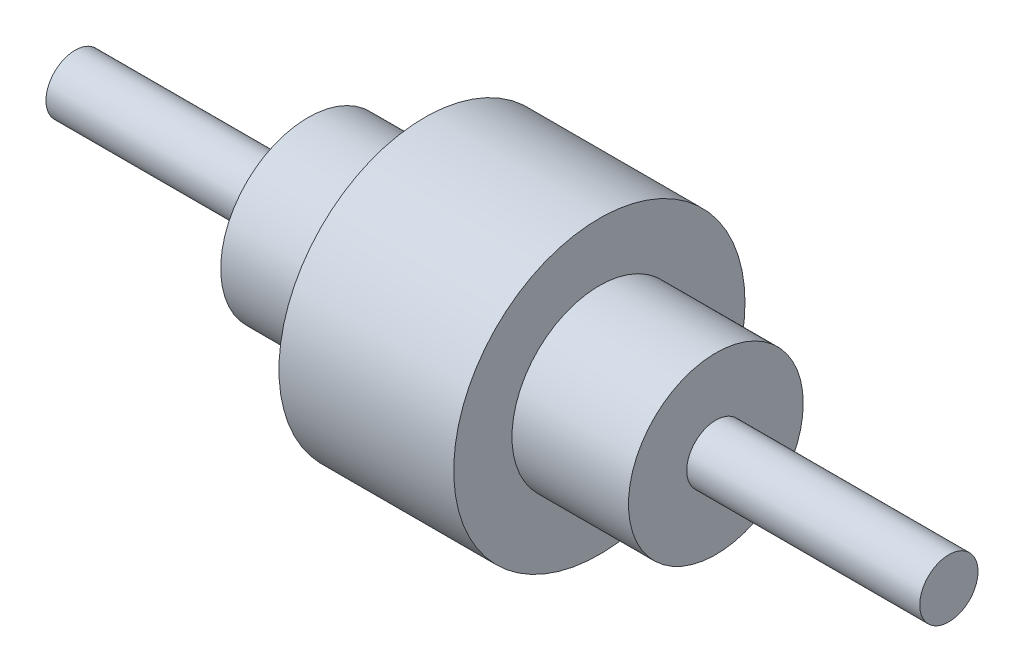
ISO-10303-21;
HEADER;
FILE_DESCRIPTION(('STEP AP214'),'2;1');
FILE_NAME('part.step','',(''),(''),'','','');
FILE_SCHEMA(('AUTOMOTIVE_DESIGN { 1 0 10303 214 1 1 1 1 }'));
ENDSEC;
DATA;
#1=APPLICATION_CONTEXT('core data for automotive mechanical design processes');
#2=APPLICATION_PROTOCOL_DEFINITION('international standard','automotive_design',2000,#1);
#3=PRODUCT_CONTEXT('',#1,'mechanical');
#4=PRODUCT('Part','Part','',(#3));
#5=PRODUCT_RELATED_PRODUCT_CATEGORY('part','',(#4));
#6=PRODUCT_DEFINITION_FORMATION('','',#4);
#7=PRODUCT_DEFINITION_CONTEXT('part definition',#1,'design');
#8=PRODUCT_DEFINITION('design','',#6,#7);
#9=PRODUCT_DEFINITION_SHAPE('','',#8);
#10=(LENGTH_UNIT() NAMED_UNIT(*) SI_UNIT(.MILLI.,.METRE.));
#11=(NAMED_UNIT(*) PLANE_ANGLE_UNIT() SI_UNIT($,.RADIAN.));
#12=(NAMED_UNIT(*) SI_UNIT($,.STERADIAN.) SOLID_ANGLE_UNIT());
#13=UNCERTAINTY_MEASURE_WITH_UNIT(LENGTH_MEASURE(1.E-05),#10,'distance_accuracy_value','');
#14=(GEOMETRIC_REPRESENTATION_CONTEXT(3) GLOBAL_UNCERTAINTY_ASSIGNED_CONTEXT((#13)) GLOBAL_UNIT_ASSIGNED_CONTEXT((#10,
#11,#12)) REPRESENTATION_CONTEXT('',''));
#15=CARTESIAN_POINT('',(0.,0.,0.));
#16=DIRECTION('',(0.,0.,1.));
#17=DIRECTION('',(1.,0.,0.));
#18=AXIS2_PLACEMENT_3D('',#15,#16,#17);
#19=CARTESIAN_POINT('',(2032.,0.,0.));
#20=DIRECTION('',(-1.,0.,0.));
#21=DIRECTION('',(0.,0.,1.));
#22=AXIS2_PLACEMENT_3D('',#19,#20,#21);
#23=CYLINDRICAL_SURFACE('',#22,254.);
#24=CARTESIAN_POINT('',(2032.,0.,0.));
#25=DIRECTION('',(1.,0.,0.));
#26=DIRECTION('',(0.,0.,-1.));
#27=AXIS2_PLACEMENT_3D('',#24,#25,#26);
#28=CIRCLE('',#27,254.);
#29=CARTESIAN_POINT('',(2032.,0.,-254.));
#30=VERTEX_POINT('',#29);
#31=EDGE_CURVE('E47',#30,#30,#28,.T.);
#32=ORIENTED_EDGE('',*,*,#31,.F.);
#33=EDGE_LOOP('',(#32));
#34=FACE_BOUND('',#33,.T.);
#35=CARTESIAN_POINT('',(0.,0.,0.));
#36=DIRECTION('',(1.,0.,0.));
#37=DIRECTION('',(0.,0.,-1.));
#38=AXIS2_PLACEMENT_3D('',#35,#36,#37);
#39=CIRCLE('',#38,254.);
#40=CARTESIAN_POINT('',(0.,0.,-254.));
#41=VERTEX_POINT('',#40);
#42=EDGE_CURVE('E37',#41,#41,#39,.T.);
#43=ORIENTED_EDGE('',*,*,#42,.T.);
#44=EDGE_LOOP('',(#43));
#45=FACE_BOUND('',#44,.T.);
#46=ADVANCED_FACE('F40',(#34,#45),#23,.T.);
#47=CARTESIAN_POINT('',(0.,0.,0.));
#48=DIRECTION('',(1.,0.,0.));
#49=DIRECTION('',(0.,0.,-1.));
#50=AXIS2_PLACEMENT_3D('',#47,#48,#49);
#51=PLANE('',#50);
#52=ORIENTED_EDGE('',*,*,#42,.F.);
#53=EDGE_LOOP('',(#52));
#54=FACE_BOUND('',#53,.T.);
#55=ADVANCED_FACE('F73',(#54),#51,.F.);
#56=CARTESIAN_POINT('',(3048.,0.,0.));
#57=DIRECTION('',(-1.,0.,0.));
#58=DIRECTION('',(0.,0.,1.));
#59=AXIS2_PLACEMENT_3D('',#56,#57,#58);
#60=CYLINDRICAL_SURFACE('',#59,762.);
#61=CARTESIAN_POINT('',(3048.,0.,0.));
#62=DIRECTION('',(1.,0.,0.));
#63=DIRECTION('',(0.,0.,-1.));
#64=AXIS2_PLACEMENT_3D('',#61,#62,#63);
#65=CIRCLE('',#64,762.);
#66=CARTESIAN_POINT('',(3048.,0.,-762.));
#67=VERTEX_POINT('',#66);
#68=EDGE_CURVE('E63',#67,#67,#65,.T.);
#69=ORIENTED_EDGE('',*,*,#68,.F.);
#70=EDGE_LOOP('',(#69));
#71=FACE_BOUND('',#70,.T.);
#72=CARTESIAN_POINT('',(2032.,0.,0.));
#73=DIRECTION('',(1.,0.,0.));
#74=DIRECTION('',(0.,0.,-1.));
#75=AXIS2_PLACEMENT_3D('',#72,#73,#74);
#76=CIRCLE('',#75,762.);
#77=CARTESIAN_POINT('',(2032.,0.,-762.));
#78=VERTEX_POINT('',#77);
#79=EDGE_CURVE('E64',#78,#78,#76,.T.);
#80=ORIENTED_EDGE('',*,*,#79,.T.);
#81=EDGE_LOOP('',(#80));
#82=FACE_BOUND('',#81,.T.);
#83=ADVANCED_FACE('F76',(#71,#82),#60,.T.);
#84=CARTESIAN_POINT('',(2032.,0.,0.));
#85=DIRECTION('',(1.,0.,0.));
#86=DIRECTION('',(0.,0.,-1.));
#87=AXIS2_PLACEMENT_3D('',#84,#85,#86);
#88=PLANE('',#87);
#89=ORIENTED_EDGE('',*,*,#31,.T.);
#90=EDGE_LOOP('',(#89));
#91=FACE_BOUND('',#90,.T.);
#92=ORIENTED_EDGE('',*,*,#79,.F.);
#93=EDGE_LOOP('',(#92));
#94=FACE_BOUND('',#93,.T.);
#95=ADVANCED_FACE('F84',(#91,#94),#88,.F.);
#96=CARTESIAN_POINT('',(4572.,0.,0.));
#97=DIRECTION('',(-1.,0.,0.));
#98=DIRECTION('',(0.,0.,1.));
#99=AXIS2_PLACEMENT_3D('',#96,#97,#98);
#100=CYLINDRICAL_SURFACE('',#99,1270.);
#101=CARTESIAN_POINT('',(4572.,0.,0.));
#102=DIRECTION('',(1.,0.,0.));
#103=DIRECTION('',(0.,0.,-1.));
#104=AXIS2_PLACEMENT_3D('',#101,#102,#103);
#105=CIRCLE('',#104,1270.);
#106=CARTESIAN_POINT('',(4572.,0.,-1270.));
#107=VERTEX_POINT('',#106);
#108=EDGE_CURVE('E59',#107,#107,#105,.T.);
#109=ORIENTED_EDGE('',*,*,#108,.F.);
#110=EDGE_LOOP('',(#109));
#111=FACE_BOUND('',#110,.T.);
#112=CARTESIAN_POINT('',(3048.,0.,0.));
#113=DIRECTION('',(1.,0.,0.));
#114=DIRECTION('',(0.,0.,-1.));
#115=AXIS2_PLACEMENT_3D('',#112,#113,#114);
#116=CIRCLE('',#115,1270.);
#117=CARTESIAN_POINT('',(3048.,0.,-1270.));
#118=VERTEX_POINT('',#117);
#119=EDGE_CURVE('E57',#118,#118,#116,.T.);
#120=ORIENTED_EDGE('',*,*,#119,.T.);
#121=EDGE_LOOP('',(#120));
#122=FACE_BOUND('',#121,.T.);
#123=ADVANCED_FACE('F90',(#111,#122),#100,.T.);
#124=CARTESIAN_POINT('',(4572.,0.,0.));
#125=DIRECTION('',(1.,0.,0.));
#126=DIRECTION('',(0.,0.,-1.));
#127=AXIS2_PLACEMENT_3D('',#124,#125,#126);
#128=PLANE('',#127);
#129=CARTESIAN_POINT('',(4572.,0.,0.));
#130=DIRECTION('',(1.,0.,0.));
#131=DIRECTION('',(0.,0.,-1.));
#132=AXIS2_PLACEMENT_3D('',#129,#130,#131);
#133=CIRCLE('',#132,762.);
#134=CARTESIAN_POINT('',(4572.,0.,-762.));
#135=VERTEX_POINT('',#134);
#136=EDGE_CURVE('E42',#135,#135,#133,.T.);
#137=ORIENTED_EDGE('',*,*,#136,.F.);
#138=EDGE_LOOP('',(#137));
#139=FACE_BOUND('',#138,.T.);
#140=ORIENTED_EDGE('',*,*,#108,.T.);
#141=EDGE_LOOP('',(#140));
#142=FACE_BOUND('',#141,.T.);
#143=ADVANCED_FACE('F95',(#139,#142),#128,.T.);
#144=CARTESIAN_POINT('',(3048.,0.,0.));
#145=DIRECTION('',(1.,0.,0.));
#146=DIRECTION('',(0.,0.,-1.));
#147=AXIS2_PLACEMENT_3D('',#144,#145,#146);
#148=PLANE('',#147);
#149=ORIENTED_EDGE('',*,*,#68,.T.);
#150=EDGE_LOOP('',(#149));
#151=FACE_BOUND('',#150,.T.);
#152=ORIENTED_EDGE('',*,*,#119,.F.);
#153=EDGE_LOOP('',(#152));
#154=FACE_BOUND('',#153,.T.);
#155=ADVANCED_FACE('F94',(#151,#154),#148,.F.);
#156=CARTESIAN_POINT('',(5588.,0.,0.));
#157=DIRECTION('',(-1.,0.,0.));
#158=DIRECTION('',(0.,0.,1.));
#159=AXIS2_PLACEMENT_3D('',#156,#157,#158);
#160=CYLINDRICAL_SURFACE('',#159,762.);
#161=CARTESIAN_POINT('',(5588.,0.,0.));
#162=DIRECTION('',(1.,0.,0.));
#163=DIRECTION('',(0.,0.,-1.));
#164=AXIS2_PLACEMENT_3D('',#161,#162,#163);
#165=CIRCLE('',#164,762.);
#166=CARTESIAN_POINT('',(5588.,0.,-762.));
#167=VERTEX_POINT('',#166);
#168=EDGE_CURVE('E53',#167,#167,#165,.T.);
#169=ORIENTED_EDGE('',*,*,#168,.F.);
#170=EDGE_LOOP('',(#169));
#171=FACE_BOUND('',#170,.T.);
#172=ORIENTED_EDGE('',*,*,#136,.T.);
#173=EDGE_LOOP('',(#172));
#174=FACE_BOUND('',#173,.T.);
#175=ADVANCED_FACE('F100',(#171,#174),#160,.T.);
#176=CARTESIAN_POINT('',(5588.,0.,0.));
#177=DIRECTION('',(1.,0.,0.));
#178=DIRECTION('',(0.,0.,-1.));
#179=AXIS2_PLACEMENT_3D('',#176,#177,#178);
#180=PLANE('',#179);
#181=CARTESIAN_POINT('',(5588.,0.,0.));
#182=DIRECTION('',(1.,0.,0.));
#183=DIRECTION('',(0.,0.,-1.));
#184=AXIS2_PLACEMENT_3D('',#181,#182,#183);
#185=CIRCLE('',#184,254.);
#186=CARTESIAN_POINT('',(5588.,0.,-254.));
#187=VERTEX_POINT('',#186);
#188=EDGE_CURVE('E10',#187,#187,#185,.T.);
#189=ORIENTED_EDGE('',*,*,#188,.F.);
#190=EDGE_LOOP('',(#189));
#191=FACE_BOUND('',#190,.T.);
#192=ORIENTED_EDGE('',*,*,#168,.T.);
#193=EDGE_LOOP('',(#192));
#194=FACE_BOUND('',#193,.T.);
#195=ADVANCED_FACE('F102',(#191,#194),#180,.T.);
#196=CARTESIAN_POINT('',(7620.,0.,0.));
#197=DIRECTION('',(-1.,0.,0.));
#198=DIRECTION('',(0.,0.,1.));
#199=AXIS2_PLACEMENT_3D('',#196,#197,#198);
#200=CYLINDRICAL_SURFACE('',#199,254.);
#201=CARTESIAN_POINT('',(7620.,0.,0.));
#202=DIRECTION('',(1.,0.,0.));
#203=DIRECTION('',(0.,0.,-1.));
#204=AXIS2_PLACEMENT_3D('',#201,#202,#203);
#205=CIRCLE('',#204,254.);
#206=CARTESIAN_POINT('',(7620.,0.,-254.));
#207=VERTEX_POINT('',#206);
#208=EDGE_CURVE('E52',#207,#207,#205,.T.);
#209=ORIENTED_EDGE('',*,*,#208,.F.);
#210=EDGE_LOOP('',(#209));
#211=FACE_BOUND('',#210,.T.);
#212=ORIENTED_EDGE('',*,*,#188,.T.);
#213=EDGE_LOOP('',(#212));
#214=FACE_BOUND('',#213,.T.);
#215=ADVANCED_FACE('F107',(#211,#214),#200,.T.);
#216=CARTESIAN_POINT('',(7620.,0.,0.));
#217=DIRECTION('',(1.,0.,0.));
#218=DIRECTION('',(0.,0.,-1.));
#219=AXIS2_PLACEMENT_3D('',#216,#217,#218);
#220=PLANE('',#219);
#221=ORIENTED_EDGE('',*,*,#208,.T.);
#222=EDGE_LOOP('',(#221));
#223=FACE_BOUND('',#222,.T.);
#224=ADVANCED_FACE('F115',(#223),#220,.T.);
#225=CLOSED_SHELL('',(#46,#55,#83,#95,#123,#143,#155,#175,#195,#215,#224));
#226=MANIFOLD_SOLID_BREP('B2',#225);
#227=ADVANCED_BREP_SHAPE_REPRESENTATION('',(#18,#226),#14);
#228=SHAPE_DEFINITION_REPRESENTATION(#9,#227);
ENDSEC;
END-ISO-10303-21;
